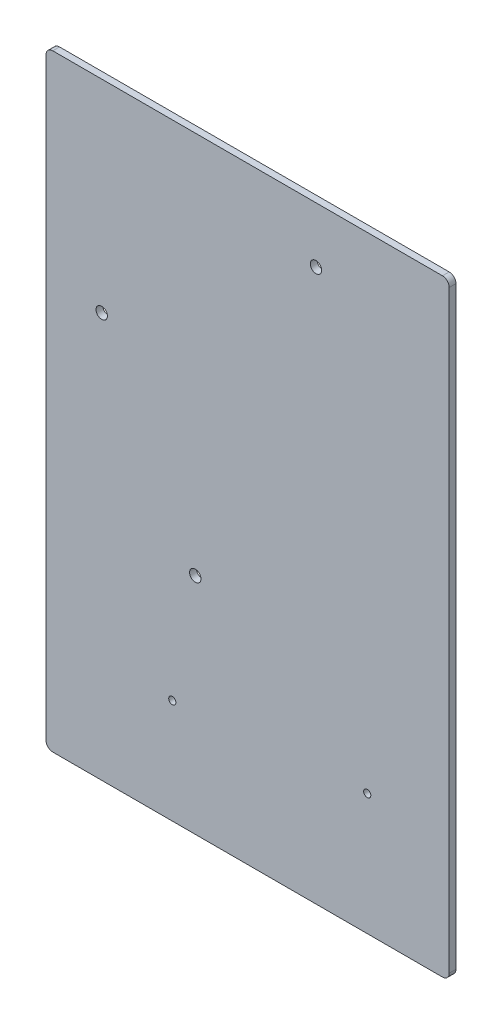
ISO-10303-21;
HEADER;
FILE_DESCRIPTION(('STEP AP214'),'2;1');
FILE_NAME('part.step','',(''),(''),'','','');
FILE_SCHEMA(('AUTOMOTIVE_DESIGN { 1 0 10303 214 1 1 1 1 }'));
ENDSEC;
DATA;
#1=APPLICATION_CONTEXT('core data for automotive mechanical design processes');
#2=APPLICATION_PROTOCOL_DEFINITION('international standard','automotive_design',2000,#1);
#3=PRODUCT_CONTEXT('',#1,'mechanical');
#4=PRODUCT('Part','Part','',(#3));
#5=PRODUCT_RELATED_PRODUCT_CATEGORY('part','',(#4));
#6=PRODUCT_DEFINITION_FORMATION('','',#4);
#7=PRODUCT_DEFINITION_CONTEXT('part definition',#1,'design');
#8=PRODUCT_DEFINITION('design','',#6,#7);
#9=PRODUCT_DEFINITION_SHAPE('','',#8);
#10=(LENGTH_UNIT() NAMED_UNIT(*) SI_UNIT(.MILLI.,.METRE.));
#11=(NAMED_UNIT(*) PLANE_ANGLE_UNIT() SI_UNIT($,.RADIAN.));
#12=(NAMED_UNIT(*) SI_UNIT($,.STERADIAN.) SOLID_ANGLE_UNIT());
#13=UNCERTAINTY_MEASURE_WITH_UNIT(LENGTH_MEASURE(1.E-05),#10,'distance_accuracy_value','');
#14=(GEOMETRIC_REPRESENTATION_CONTEXT(3) GLOBAL_UNCERTAINTY_ASSIGNED_CONTEXT((#13)) GLOBAL_UNIT_ASSIGNED_CONTEXT((#10,
#11,#12)) REPRESENTATION_CONTEXT('',''));
#15=CARTESIAN_POINT('',(0.,0.,0.));
#16=DIRECTION('',(0.,0.,1.));
#17=DIRECTION('',(1.,0.,0.));
#18=AXIS2_PLACEMENT_3D('',#15,#16,#17);
#19=CARTESIAN_POINT('',(0.,0.,6.35));
#20=DIRECTION('',(0.,1.,0.));
#21=DIRECTION('',(0.,0.,1.));
#22=AXIS2_PLACEMENT_3D('',#19,#20,#21);
#23=PLANE('',#22);
#24=DIRECTION('',(1.,0.,0.));
#25=VECTOR('',#24,1.);
#26=CARTESIAN_POINT('',(0.,0.,0.));
#27=LINE('',#26,#25);
#28=CARTESIAN_POINT('',(6.35,0.,0.));
#29=VERTEX_POINT('',#28);
#30=CARTESIAN_POINT('',(373.0625,0.,0.));
#31=VERTEX_POINT('',#30);
#32=EDGE_CURVE('E166',#29,#31,#27,.T.);
#33=ORIENTED_EDGE('',*,*,#32,.T.);
#34=DIRECTION('',(0.,0.,-1.));
#35=VECTOR('',#34,1.);
#36=CARTESIAN_POINT('',(373.0625,0.,6.35));
#37=LINE('',#36,#35);
#38=CARTESIAN_POINT('',(373.0625,0.,6.35));
#39=VERTEX_POINT('',#38);
#40=EDGE_CURVE('E140',#31,#39,#37,.F.);
#41=ORIENTED_EDGE('',*,*,#40,.T.);
#42=DIRECTION('',(1.,0.,0.));
#43=VECTOR('',#42,1.);
#44=CARTESIAN_POINT('',(0.,0.,6.35));
#45=LINE('',#44,#43);
#46=CARTESIAN_POINT('',(6.35,0.,6.35));
#47=VERTEX_POINT('',#46);
#48=EDGE_CURVE('E108',#47,#39,#45,.T.);
#49=ORIENTED_EDGE('',*,*,#48,.F.);
#50=DIRECTION('',(0.,0.,-1.));
#51=VECTOR('',#50,1.);
#52=CARTESIAN_POINT('',(6.35,0.,6.35));
#53=LINE('',#52,#51);
#54=EDGE_CURVE('E137',#47,#29,#53,.T.);
#55=ORIENTED_EDGE('',*,*,#54,.T.);
#56=EDGE_LOOP('',(#33,#41,#49,#55));
#57=FACE_BOUND('',#56,.T.);
#58=ADVANCED_FACE('F35',(#57),#23,.F.);
#59=CARTESIAN_POINT('',(379.4125,571.5,6.35));
#60=DIRECTION('',(-1.,0.,0.));
#61=DIRECTION('',(0.,0.,1.));
#62=AXIS2_PLACEMENT_3D('',#59,#60,#61);
#63=PLANE('',#62);
#64=DIRECTION('',(0.,1.,0.));
#65=VECTOR('',#64,1.);
#66=CARTESIAN_POINT('',(379.4125,0.,6.35));
#67=LINE('',#66,#65);
#68=CARTESIAN_POINT('',(379.4125,6.34999999999997,6.35));
#69=VERTEX_POINT('',#68);
#70=CARTESIAN_POINT('',(379.4125,565.15,6.35));
#71=VERTEX_POINT('',#70);
#72=EDGE_CURVE('E105',#69,#71,#67,.T.);
#73=ORIENTED_EDGE('',*,*,#72,.F.);
#74=DIRECTION('',(0.,0.,-1.));
#75=VECTOR('',#74,1.);
#76=CARTESIAN_POINT('',(379.4125,6.34999999999997,6.35));
#77=LINE('',#76,#75);
#78=CARTESIAN_POINT('',(379.4125,6.34999999999997,0.));
#79=VERTEX_POINT('',#78);
#80=EDGE_CURVE('E117',#69,#79,#77,.T.);
#81=ORIENTED_EDGE('',*,*,#80,.T.);
#82=DIRECTION('',(0.,1.,0.));
#83=VECTOR('',#82,1.);
#84=CARTESIAN_POINT('',(379.4125,0.,0.));
#85=LINE('',#84,#83);
#86=CARTESIAN_POINT('',(379.4125,565.15,0.));
#87=VERTEX_POINT('',#86);
#88=EDGE_CURVE('E164',#79,#87,#85,.T.);
#89=ORIENTED_EDGE('',*,*,#88,.T.);
#90=DIRECTION('',(0.,0.,-1.));
#91=VECTOR('',#90,1.);
#92=CARTESIAN_POINT('',(379.4125,565.15,6.35));
#93=LINE('',#92,#91);
#94=EDGE_CURVE('E120',#87,#71,#93,.F.);
#95=ORIENTED_EDGE('',*,*,#94,.T.);
#96=EDGE_LOOP('',(#73,#81,#89,#95));
#97=FACE_BOUND('',#96,.T.);
#98=ADVANCED_FACE('F115',(#97),#63,.F.);
#99=CARTESIAN_POINT('',(379.4125,571.5,6.35));
#100=DIRECTION('',(0.,-1.,0.));
#101=DIRECTION('',(0.,0.,-1.));
#102=AXIS2_PLACEMENT_3D('',#99,#100,#101);
#103=PLANE('',#102);
#104=DIRECTION('',(-1.,0.,0.));
#105=VECTOR('',#104,1.);
#106=CARTESIAN_POINT('',(379.4125,571.5,0.));
#107=LINE('',#106,#105);
#108=CARTESIAN_POINT('',(373.0625,571.5,0.));
#109=VERTEX_POINT('',#108);
#110=CARTESIAN_POINT('',(6.35000000000002,571.5,0.));
#111=VERTEX_POINT('',#110);
#112=EDGE_CURVE('E157',#109,#111,#107,.T.);
#113=ORIENTED_EDGE('',*,*,#112,.T.);
#114=DIRECTION('',(0.,0.,-1.));
#115=VECTOR('',#114,1.);
#116=CARTESIAN_POINT('',(6.35000000000002,571.5,6.35));
#117=LINE('',#116,#115);
#118=CARTESIAN_POINT('',(6.35000000000002,571.5,6.35));
#119=VERTEX_POINT('',#118);
#120=EDGE_CURVE('E11',#111,#119,#117,.F.);
#121=ORIENTED_EDGE('',*,*,#120,.T.);
#122=DIRECTION('',(-1.,0.,0.));
#123=VECTOR('',#122,1.);
#124=CARTESIAN_POINT('',(379.4125,571.5,6.35));
#125=LINE('',#124,#123);
#126=CARTESIAN_POINT('',(373.0625,571.5,6.35));
#127=VERTEX_POINT('',#126);
#128=EDGE_CURVE('E121',#127,#119,#125,.T.);
#129=ORIENTED_EDGE('',*,*,#128,.F.);
#130=DIRECTION('',(0.,0.,-1.));
#131=VECTOR('',#130,1.);
#132=CARTESIAN_POINT('',(373.0625,571.5,6.35));
#133=LINE('',#132,#131);
#134=EDGE_CURVE('E43',#127,#109,#133,.T.);
#135=ORIENTED_EDGE('',*,*,#134,.T.);
#136=EDGE_LOOP('',(#113,#121,#129,#135));
#137=FACE_BOUND('',#136,.T.);
#138=ADVANCED_FACE('F156',(#137),#103,.F.);
#139=CARTESIAN_POINT('',(0.,0.,6.35));
#140=DIRECTION('',(1.,0.,0.));
#141=DIRECTION('',(0.,0.,-1.));
#142=AXIS2_PLACEMENT_3D('',#139,#140,#141);
#143=PLANE('',#142);
#144=DIRECTION('',(0.,-1.,0.));
#145=VECTOR('',#144,1.);
#146=CARTESIAN_POINT('',(0.,0.,6.35));
#147=LINE('',#146,#145);
#148=CARTESIAN_POINT('',(0.,565.15,6.35));
#149=VERTEX_POINT('',#148);
#150=CARTESIAN_POINT('',(0.,6.35,6.35));
#151=VERTEX_POINT('',#150);
#152=EDGE_CURVE('E129',#149,#151,#147,.T.);
#153=ORIENTED_EDGE('',*,*,#152,.F.);
#154=DIRECTION('',(0.,0.,-1.));
#155=VECTOR('',#154,1.);
#156=CARTESIAN_POINT('',(0.,565.15,6.35));
#157=LINE('',#156,#155);
#158=CARTESIAN_POINT('',(0.,565.15,0.));
#159=VERTEX_POINT('',#158);
#160=EDGE_CURVE('E148',#149,#159,#157,.T.);
#161=ORIENTED_EDGE('',*,*,#160,.T.);
#162=DIRECTION('',(0.,-1.,0.));
#163=VECTOR('',#162,1.);
#164=CARTESIAN_POINT('',(0.,0.,0.));
#165=LINE('',#164,#163);
#166=CARTESIAN_POINT('',(0.,6.35,0.));
#167=VERTEX_POINT('',#166);
#168=EDGE_CURVE('E163',#159,#167,#165,.T.);
#169=ORIENTED_EDGE('',*,*,#168,.T.);
#170=DIRECTION('',(0.,0.,-1.));
#171=VECTOR('',#170,1.);
#172=CARTESIAN_POINT('',(0.,6.35,6.35));
#173=LINE('',#172,#171);
#174=EDGE_CURVE('E50',#167,#151,#173,.F.);
#175=ORIENTED_EDGE('',*,*,#174,.T.);
#176=EDGE_LOOP('',(#153,#161,#169,#175));
#177=FACE_BOUND('',#176,.T.);
#178=ADVANCED_FACE('F254',(#177),#143,.F.);
#179=CARTESIAN_POINT('',(0.,0.,6.35));
#180=DIRECTION('',(0.,0.,1.));
#181=DIRECTION('',(1.,0.,0.));
#182=AXIS2_PLACEMENT_3D('',#179,#180,#181);
#183=PLANE('',#182);
#184=CARTESIAN_POINT('',(254.,519.1125,6.35));
#185=DIRECTION('',(0.,0.,-1.));
#186=DIRECTION('',(-1.,0.,0.));
#187=AXIS2_PLACEMENT_3D('',#184,#185,#186);
#188=CIRCLE('',#187,5.35787599999998);
#189=CARTESIAN_POINT('',(248.642124,519.1125,6.35));
#190=VERTEX_POINT('',#189);
#191=EDGE_CURVE('E198',#190,#190,#188,.T.);
#192=ORIENTED_EDGE('',*,*,#191,.T.);
#193=EDGE_LOOP('',(#192));
#194=FACE_BOUND('',#193,.T.);
#195=CARTESIAN_POINT('',(52.3875,381.,6.35));
#196=DIRECTION('',(0.,0.,-1.));
#197=DIRECTION('',(-1.,0.,0.));
#198=AXIS2_PLACEMENT_3D('',#195,#196,#197);
#199=CIRCLE('',#198,5.357876);
#200=CARTESIAN_POINT('',(47.029624,381.,6.35));
#201=VERTEX_POINT('',#200);
#202=EDGE_CURVE('E192',#201,#201,#199,.T.);
#203=ORIENTED_EDGE('',*,*,#202,.T.);
#204=EDGE_LOOP('',(#203));
#205=FACE_BOUND('',#204,.T.);
#206=CARTESIAN_POINT('',(140.462,210.82,6.35));
#207=DIRECTION('',(0.,0.,-1.));
#208=DIRECTION('',(-1.,0.,0.));
#209=AXIS2_PLACEMENT_3D('',#206,#207,#208);
#210=CIRCLE('',#209,5.35787600000001);
#211=CARTESIAN_POINT('',(135.104124,210.82,6.35));
#212=VERTEX_POINT('',#211);
#213=EDGE_CURVE('E186',#212,#212,#210,.T.);
#214=ORIENTED_EDGE('',*,*,#213,.T.);
#215=EDGE_LOOP('',(#214));
#216=FACE_BOUND('',#215,.T.);
#217=ORIENTED_EDGE('',*,*,#48,.T.);
#218=CARTESIAN_POINT('',(373.0625,6.34999999999997,6.35));
#219=DIRECTION('',(0.,0.,1.));
#220=DIRECTION('',(1.,0.,0.));
#221=AXIS2_PLACEMENT_3D('',#218,#219,#220);
#222=CIRCLE('',#221,6.35);
#223=EDGE_CURVE('E101',#39,#69,#222,.T.);
#224=ORIENTED_EDGE('',*,*,#223,.T.);
#225=ORIENTED_EDGE('',*,*,#72,.T.);
#226=CARTESIAN_POINT('',(373.0625,565.15,6.35));
#227=DIRECTION('',(0.,0.,1.));
#228=DIRECTION('',(1.,0.,0.));
#229=AXIS2_PLACEMENT_3D('',#226,#227,#228);
#230=CIRCLE('',#229,6.35);
#231=EDGE_CURVE('E144',#71,#127,#230,.T.);
#232=ORIENTED_EDGE('',*,*,#231,.T.);
#233=ORIENTED_EDGE('',*,*,#128,.T.);
#234=CARTESIAN_POINT('',(6.35,565.15,6.35));
#235=DIRECTION('',(0.,0.,1.));
#236=DIRECTION('',(1.,0.,0.));
#237=AXIS2_PLACEMENT_3D('',#234,#235,#236);
#238=CIRCLE('',#237,6.35);
#239=EDGE_CURVE('E57',#119,#149,#238,.T.);
#240=ORIENTED_EDGE('',*,*,#239,.T.);
#241=ORIENTED_EDGE('',*,*,#152,.T.);
#242=CARTESIAN_POINT('',(6.35,6.35,6.35));
#243=DIRECTION('',(0.,0.,1.));
#244=DIRECTION('',(1.,0.,0.));
#245=AXIS2_PLACEMENT_3D('',#242,#243,#244);
#246=CIRCLE('',#245,6.35);
#247=EDGE_CURVE('E142',#151,#47,#246,.T.);
#248=ORIENTED_EDGE('',*,*,#247,.T.);
#249=EDGE_LOOP('',(#217,#224,#225,#232,#233,#240,#241,#248));
#250=FACE_BOUND('',#249,.T.);
#251=CARTESIAN_POINT('',(118.810746346405,98.25026997302,6.35));
#252=DIRECTION('',(0.,0.,-1.));
#253=DIRECTION('',(-1.,0.,0.));
#254=AXIS2_PLACEMENT_3D('',#251,#252,#253);
#255=CIRCLE('',#254,3.3782);
#256=CARTESIAN_POINT('',(115.432546346405,98.25026997302,6.35));
#257=VERTEX_POINT('',#256);
#258=EDGE_CURVE('E180',#257,#257,#255,.T.);
#259=ORIENTED_EDGE('',*,*,#258,.T.);
#260=EDGE_LOOP('',(#259));
#261=FACE_BOUND('',#260,.T.);
#262=CARTESIAN_POINT('',(302.26,114.3,6.35));
#263=DIRECTION('',(0.,0.,-1.));
#264=DIRECTION('',(-1.,0.,0.));
#265=AXIS2_PLACEMENT_3D('',#262,#263,#264);
#266=CIRCLE('',#265,3.3782);
#267=CARTESIAN_POINT('',(298.8818,114.3,6.35));
#268=VERTEX_POINT('',#267);
#269=EDGE_CURVE('E171',#268,#268,#266,.T.);
#270=ORIENTED_EDGE('',*,*,#269,.T.);
#271=EDGE_LOOP('',(#270));
#272=FACE_BOUND('',#271,.T.);
#273=ADVANCED_FACE('F103',(#194,#205,#216,#250,#261,#272),#183,.T.);
#274=CARTESIAN_POINT('',(0.,0.,0.));
#275=DIRECTION('',(0.,0.,1.));
#276=DIRECTION('',(1.,0.,0.));
#277=AXIS2_PLACEMENT_3D('',#274,#275,#276);
#278=PLANE('',#277);
#279=CARTESIAN_POINT('',(254.,519.1125,0.));
#280=DIRECTION('',(0.,0.,-1.));
#281=DIRECTION('',(-1.,0.,0.));
#282=AXIS2_PLACEMENT_3D('',#279,#280,#281);
#283=CIRCLE('',#282,5.35787599999998);
#284=CARTESIAN_POINT('',(248.642124,519.1125,0.));
#285=VERTEX_POINT('',#284);
#286=EDGE_CURVE('E201',#285,#285,#283,.T.);
#287=ORIENTED_EDGE('',*,*,#286,.F.);
#288=EDGE_LOOP('',(#287));
#289=FACE_BOUND('',#288,.T.);
#290=CARTESIAN_POINT('',(52.3875,381.,0.));
#291=DIRECTION('',(0.,0.,-1.));
#292=DIRECTION('',(-1.,0.,0.));
#293=AXIS2_PLACEMENT_3D('',#290,#291,#292);
#294=CIRCLE('',#293,5.357876);
#295=CARTESIAN_POINT('',(47.029624,381.,0.));
#296=VERTEX_POINT('',#295);
#297=EDGE_CURVE('E195',#296,#296,#294,.T.);
#298=ORIENTED_EDGE('',*,*,#297,.F.);
#299=EDGE_LOOP('',(#298));
#300=FACE_BOUND('',#299,.T.);
#301=CARTESIAN_POINT('',(140.462,210.82,0.));
#302=DIRECTION('',(0.,0.,-1.));
#303=DIRECTION('',(-1.,0.,0.));
#304=AXIS2_PLACEMENT_3D('',#301,#302,#303);
#305=CIRCLE('',#304,5.35787600000001);
#306=CARTESIAN_POINT('',(135.104124,210.82,0.));
#307=VERTEX_POINT('',#306);
#308=EDGE_CURVE('E189',#307,#307,#305,.T.);
#309=ORIENTED_EDGE('',*,*,#308,.F.);
#310=EDGE_LOOP('',(#309));
#311=FACE_BOUND('',#310,.T.);
#312=CARTESIAN_POINT('',(118.810746346405,98.25026997302,0.));
#313=DIRECTION('',(0.,0.,-1.));
#314=DIRECTION('',(-1.,0.,0.));
#315=AXIS2_PLACEMENT_3D('',#312,#313,#314);
#316=CIRCLE('',#315,3.37819999999998);
#317=CARTESIAN_POINT('',(115.432546346405,98.25026997302,0.));
#318=VERTEX_POINT('',#317);
#319=EDGE_CURVE('E183',#318,#318,#316,.T.);
#320=ORIENTED_EDGE('',*,*,#319,.F.);
#321=EDGE_LOOP('',(#320));
#322=FACE_BOUND('',#321,.T.);
#323=CARTESIAN_POINT('',(302.26,114.3,0.));
#324=DIRECTION('',(0.,0.,-1.));
#325=DIRECTION('',(-1.,0.,0.));
#326=AXIS2_PLACEMENT_3D('',#323,#324,#325);
#327=CIRCLE('',#326,3.3782);
#328=CARTESIAN_POINT('',(298.8818,114.3,0.));
#329=VERTEX_POINT('',#328);
#330=EDGE_CURVE('E177',#329,#329,#327,.T.);
#331=ORIENTED_EDGE('',*,*,#330,.F.);
#332=EDGE_LOOP('',(#331));
#333=FACE_BOUND('',#332,.T.);
#334=ORIENTED_EDGE('',*,*,#88,.F.);
#335=CARTESIAN_POINT('',(373.0625,6.34999999999997,0.));
#336=DIRECTION('',(0.,0.,1.));
#337=DIRECTION('',(1.,0.,0.));
#338=AXIS2_PLACEMENT_3D('',#335,#336,#337);
#339=CIRCLE('',#338,6.35);
#340=EDGE_CURVE('E124',#79,#31,#339,.F.);
#341=ORIENTED_EDGE('',*,*,#340,.T.);
#342=ORIENTED_EDGE('',*,*,#32,.F.);
#343=CARTESIAN_POINT('',(6.35,6.35,0.));
#344=DIRECTION('',(0.,0.,1.));
#345=DIRECTION('',(1.,0.,0.));
#346=AXIS2_PLACEMENT_3D('',#343,#344,#345);
#347=CIRCLE('',#346,6.35);
#348=EDGE_CURVE('E125',#29,#167,#347,.F.);
#349=ORIENTED_EDGE('',*,*,#348,.T.);
#350=ORIENTED_EDGE('',*,*,#168,.F.);
#351=CARTESIAN_POINT('',(6.35,565.15,0.));
#352=DIRECTION('',(0.,0.,1.));
#353=DIRECTION('',(1.,0.,0.));
#354=AXIS2_PLACEMENT_3D('',#351,#352,#353);
#355=CIRCLE('',#354,6.35);
#356=EDGE_CURVE('E134',#159,#111,#355,.F.);
#357=ORIENTED_EDGE('',*,*,#356,.T.);
#358=ORIENTED_EDGE('',*,*,#112,.F.);
#359=CARTESIAN_POINT('',(373.0625,565.15,0.));
#360=DIRECTION('',(0.,0.,1.));
#361=DIRECTION('',(1.,0.,0.));
#362=AXIS2_PLACEMENT_3D('',#359,#360,#361);
#363=CIRCLE('',#362,6.35);
#364=EDGE_CURVE('E127',#109,#87,#363,.F.);
#365=ORIENTED_EDGE('',*,*,#364,.T.);
#366=EDGE_LOOP('',(#334,#341,#342,#349,#350,#357,#358,#365));
#367=FACE_BOUND('',#366,.T.);
#368=ADVANCED_FACE('F161',(#289,#300,#311,#322,#333,#367),#278,.F.);
#369=CARTESIAN_POINT('',(302.26,114.3,0.));
#370=DIRECTION('',(0.,0.,-1.));
#371=DIRECTION('',(-1.,0.,0.));
#372=AXIS2_PLACEMENT_3D('',#369,#370,#371);
#373=CYLINDRICAL_SURFACE('',#372,3.3782);
#374=ORIENTED_EDGE('',*,*,#269,.F.);
#375=EDGE_LOOP('',(#374));
#376=FACE_BOUND('',#375,.T.);
#377=ORIENTED_EDGE('',*,*,#330,.T.);
#378=EDGE_LOOP('',(#377));
#379=FACE_BOUND('',#378,.T.);
#380=ADVANCED_FACE('F209',(#376,#379),#373,.F.);
#381=CARTESIAN_POINT('',(118.810746346405,98.25026997302,0.));
#382=DIRECTION('',(0.,0.,-1.));
#383=DIRECTION('',(-1.,0.,0.));
#384=AXIS2_PLACEMENT_3D('',#381,#382,#383);
#385=CYLINDRICAL_SURFACE('',#384,3.37819999999999);
#386=ORIENTED_EDGE('',*,*,#258,.F.);
#387=EDGE_LOOP('',(#386));
#388=FACE_BOUND('',#387,.T.);
#389=ORIENTED_EDGE('',*,*,#319,.T.);
#390=EDGE_LOOP('',(#389));
#391=FACE_BOUND('',#390,.T.);
#392=ADVANCED_FACE('F220',(#388,#391),#385,.F.);
#393=CARTESIAN_POINT('',(140.462,210.82,0.));
#394=DIRECTION('',(0.,0.,-1.));
#395=DIRECTION('',(-1.,0.,0.));
#396=AXIS2_PLACEMENT_3D('',#393,#394,#395);
#397=CYLINDRICAL_SURFACE('',#396,5.35787600000001);
#398=ORIENTED_EDGE('',*,*,#213,.F.);
#399=EDGE_LOOP('',(#398));
#400=FACE_BOUND('',#399,.T.);
#401=ORIENTED_EDGE('',*,*,#308,.T.);
#402=EDGE_LOOP('',(#401));
#403=FACE_BOUND('',#402,.T.);
#404=ADVANCED_FACE('F227',(#400,#403),#397,.F.);
#405=CARTESIAN_POINT('',(52.3875,381.,0.));
#406=DIRECTION('',(0.,0.,-1.));
#407=DIRECTION('',(-1.,0.,0.));
#408=AXIS2_PLACEMENT_3D('',#405,#406,#407);
#409=CYLINDRICAL_SURFACE('',#408,5.357876);
#410=ORIENTED_EDGE('',*,*,#202,.F.);
#411=EDGE_LOOP('',(#410));
#412=FACE_BOUND('',#411,.T.);
#413=ORIENTED_EDGE('',*,*,#297,.T.);
#414=EDGE_LOOP('',(#413));
#415=FACE_BOUND('',#414,.T.);
#416=ADVANCED_FACE('F318',(#412,#415),#409,.F.);
#417=CARTESIAN_POINT('',(254.,519.1125,0.));
#418=DIRECTION('',(0.,0.,-1.));
#419=DIRECTION('',(-1.,0.,0.));
#420=AXIS2_PLACEMENT_3D('',#417,#418,#419);
#421=CYLINDRICAL_SURFACE('',#420,5.35787599999998);
#422=ORIENTED_EDGE('',*,*,#191,.F.);
#423=EDGE_LOOP('',(#422));
#424=FACE_BOUND('',#423,.T.);
#425=ORIENTED_EDGE('',*,*,#286,.T.);
#426=EDGE_LOOP('',(#425));
#427=FACE_BOUND('',#426,.T.);
#428=ADVANCED_FACE('F205',(#424,#427),#421,.F.);
#429=CARTESIAN_POINT('',(373.0625,6.34999999999997,6.35));
#430=DIRECTION('',(0.,0.,-1.));
#431=DIRECTION('',(-1.,0.,0.));
#432=AXIS2_PLACEMENT_3D('',#429,#430,#431);
#433=CYLINDRICAL_SURFACE('',#432,6.35);
#434=ORIENTED_EDGE('',*,*,#223,.F.);
#435=ORIENTED_EDGE('',*,*,#40,.F.);
#436=ORIENTED_EDGE('',*,*,#340,.F.);
#437=ORIENTED_EDGE('',*,*,#80,.F.);
#438=EDGE_LOOP('',(#434,#435,#436,#437));
#439=FACE_BOUND('',#438,.T.);
#440=ADVANCED_FACE('F123',(#439),#433,.T.);
#441=CARTESIAN_POINT('',(6.35,565.15,6.35));
#442=DIRECTION('',(0.,0.,-1.));
#443=DIRECTION('',(-1.,0.,0.));
#444=AXIS2_PLACEMENT_3D('',#441,#442,#443);
#445=CYLINDRICAL_SURFACE('',#444,6.35);
#446=ORIENTED_EDGE('',*,*,#239,.F.);
#447=ORIENTED_EDGE('',*,*,#120,.F.);
#448=ORIENTED_EDGE('',*,*,#356,.F.);
#449=ORIENTED_EDGE('',*,*,#160,.F.);
#450=EDGE_LOOP('',(#446,#447,#448,#449));
#451=FACE_BOUND('',#450,.T.);
#452=ADVANCED_FACE('F244',(#451),#445,.T.);
#453=CARTESIAN_POINT('',(373.0625,565.15,6.35));
#454=DIRECTION('',(0.,0.,-1.));
#455=DIRECTION('',(-1.,0.,0.));
#456=AXIS2_PLACEMENT_3D('',#453,#454,#455);
#457=CYLINDRICAL_SURFACE('',#456,6.35);
#458=ORIENTED_EDGE('',*,*,#231,.F.);
#459=ORIENTED_EDGE('',*,*,#94,.F.);
#460=ORIENTED_EDGE('',*,*,#364,.F.);
#461=ORIENTED_EDGE('',*,*,#134,.F.);
#462=EDGE_LOOP('',(#458,#459,#460,#461));
#463=FACE_BOUND('',#462,.T.);
#464=ADVANCED_FACE('F246',(#463),#457,.T.);
#465=CARTESIAN_POINT('',(6.35,6.35,6.35));
#466=DIRECTION('',(0.,0.,-1.));
#467=DIRECTION('',(-1.,0.,0.));
#468=AXIS2_PLACEMENT_3D('',#465,#466,#467);
#469=CYLINDRICAL_SURFACE('',#468,6.35);
#470=ORIENTED_EDGE('',*,*,#247,.F.);
#471=ORIENTED_EDGE('',*,*,#174,.F.);
#472=ORIENTED_EDGE('',*,*,#348,.F.);
#473=ORIENTED_EDGE('',*,*,#54,.F.);
#474=EDGE_LOOP('',(#470,#471,#472,#473));
#475=FACE_BOUND('',#474,.T.);
#476=ADVANCED_FACE('F37',(#475),#469,.T.);
#477=CLOSED_SHELL('',(#58,#98,#138,#178,#273,#368,#380,#392,#404,#416,#428,#440,#452,#464,#476));
#478=MANIFOLD_SOLID_BREP('B2',#477);
#479=ADVANCED_BREP_SHAPE_REPRESENTATION('',(#18,#478),#14);
#480=SHAPE_DEFINITION_REPRESENTATION(#9,#479);
ENDSEC;
END-ISO-10303-21;
